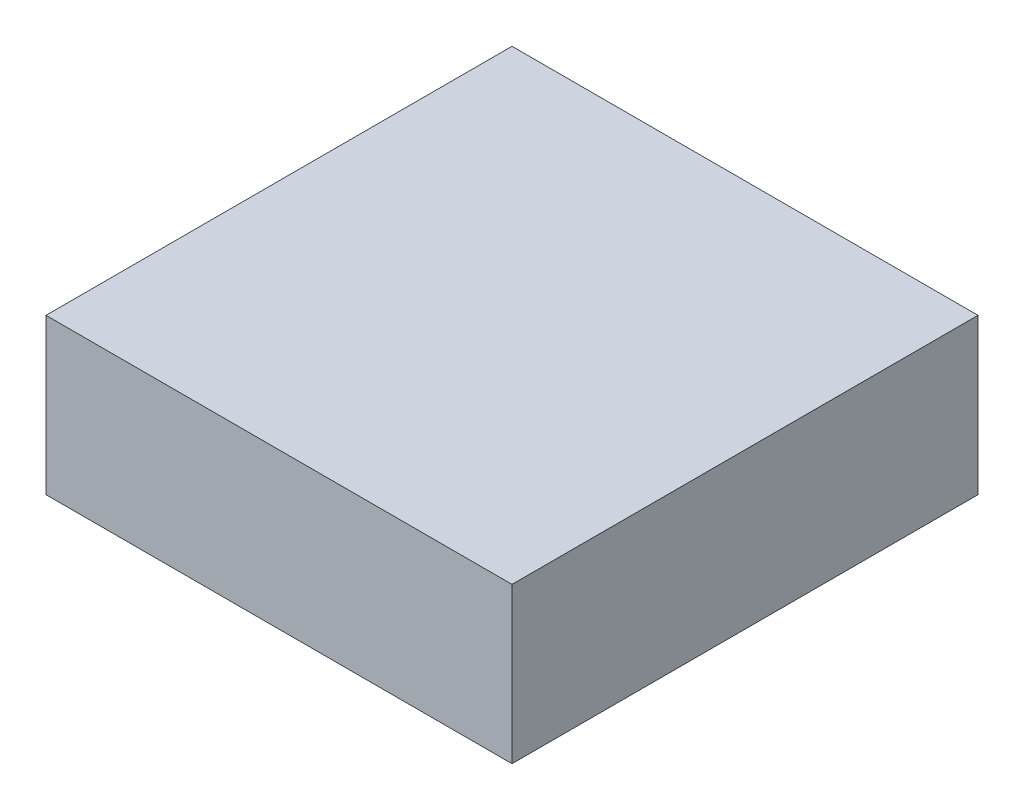
ISO-10303-21;
HEADER;
FILE_DESCRIPTION(('STEP AP214'),'2;1');
FILE_NAME('part.step','',(''),(''),'','','');
FILE_SCHEMA(('AUTOMOTIVE_DESIGN { 1 0 10303 214 1 1 1 1 }'));
ENDSEC;
DATA;
#1=APPLICATION_CONTEXT('core data for automotive mechanical design processes');
#2=APPLICATION_PROTOCOL_DEFINITION('international standard','automotive_design',2000,#1);
#3=PRODUCT_CONTEXT('',#1,'mechanical');
#4=PRODUCT('Part','Part','',(#3));
#5=PRODUCT_RELATED_PRODUCT_CATEGORY('part','',(#4));
#6=PRODUCT_DEFINITION_FORMATION('','',#4);
#7=PRODUCT_DEFINITION_CONTEXT('part definition',#1,'design');
#8=PRODUCT_DEFINITION('design','',#6,#7);
#9=PRODUCT_DEFINITION_SHAPE('','',#8);
#10=(LENGTH_UNIT() NAMED_UNIT(*) SI_UNIT(.MILLI.,.METRE.));
#11=(NAMED_UNIT(*) PLANE_ANGLE_UNIT() SI_UNIT($,.RADIAN.));
#12=(NAMED_UNIT(*) SI_UNIT($,.STERADIAN.) SOLID_ANGLE_UNIT());
#13=UNCERTAINTY_MEASURE_WITH_UNIT(LENGTH_MEASURE(1.E-05),#10,'distance_accuracy_value','');
#14=(GEOMETRIC_REPRESENTATION_CONTEXT(3) GLOBAL_UNCERTAINTY_ASSIGNED_CONTEXT((#13)) GLOBAL_UNIT_ASSIGNED_CONTEXT((#10,
#11,#12)) REPRESENTATION_CONTEXT('',''));
#15=CARTESIAN_POINT('',(0.,0.,0.));
#16=DIRECTION('',(0.,0.,1.));
#17=DIRECTION('',(1.,0.,0.));
#18=AXIS2_PLACEMENT_3D('',#15,#16,#17);
#19=CARTESIAN_POINT('',(20.,10.,13.4117647058824));
#20=DIRECTION('',(-1.,0.,0.));
#21=DIRECTION('',(0.,0.,1.));
#22=AXIS2_PLACEMENT_3D('',#19,#20,#21);
#23=PLANE('',#22);
#24=DIRECTION('',(0.,0.,-1.));
#25=VECTOR('',#24,1.);
#26=CARTESIAN_POINT('',(20.,0.,13.4117647058824));
#27=LINE('',#26,#25);
#28=CARTESIAN_POINT('',(20.,0.,13.4117647058824));
#29=VERTEX_POINT('',#28);
#30=CARTESIAN_POINT('',(20.,0.,-16.5882352941176));
#31=VERTEX_POINT('',#30);
#32=EDGE_CURVE('E98',#29,#31,#27,.T.);
#33=ORIENTED_EDGE('',*,*,#32,.T.);
#34=DIRECTION('',(0.,-1.,0.));
#35=VECTOR('',#34,1.);
#36=CARTESIAN_POINT('',(20.,10.,-16.5882352941176));
#37=LINE('',#36,#35);
#38=CARTESIAN_POINT('',(20.,10.,-16.5882352941176));
#39=VERTEX_POINT('',#38);
#40=EDGE_CURVE('E11',#39,#31,#37,.T.);
#41=ORIENTED_EDGE('',*,*,#40,.F.);
#42=DIRECTION('',(0.,0.,-1.));
#43=VECTOR('',#42,1.);
#44=CARTESIAN_POINT('',(20.,10.,13.4117647058824));
#45=LINE('',#44,#43);
#46=CARTESIAN_POINT('',(20.,10.,13.4117647058824));
#47=VERTEX_POINT('',#46);
#48=EDGE_CURVE('E86',#47,#39,#45,.T.);
#49=ORIENTED_EDGE('',*,*,#48,.F.);
#50=DIRECTION('',(0.,-1.,0.));
#51=VECTOR('',#50,1.);
#52=CARTESIAN_POINT('',(20.,10.,13.4117647058824));
#53=LINE('',#52,#51);
#54=EDGE_CURVE('E94',#47,#29,#53,.T.);
#55=ORIENTED_EDGE('',*,*,#54,.T.);
#56=EDGE_LOOP('',(#33,#41,#49,#55));
#57=FACE_BOUND('',#56,.T.);
#58=ADVANCED_FACE('F35',(#57),#23,.F.);
#59=CARTESIAN_POINT('',(-10.,10.,-16.5882352941176));
#60=DIRECTION('',(0.,0.,1.));
#61=DIRECTION('',(1.,0.,0.));
#62=AXIS2_PLACEMENT_3D('',#59,#60,#61);
#63=PLANE('',#62);
#64=DIRECTION('',(-1.,0.,0.));
#65=VECTOR('',#64,1.);
#66=CARTESIAN_POINT('',(-10.,0.,-16.5882352941176));
#67=LINE('',#66,#65);
#68=CARTESIAN_POINT('',(-10.,0.,-16.5882352941176));
#69=VERTEX_POINT('',#68);
#70=EDGE_CURVE('E90',#31,#69,#67,.T.);
#71=ORIENTED_EDGE('',*,*,#70,.T.);
#72=DIRECTION('',(0.,-1.,0.));
#73=VECTOR('',#72,1.);
#74=CARTESIAN_POINT('',(-10.,10.,-16.5882352941176));
#75=LINE('',#74,#73);
#76=CARTESIAN_POINT('',(-10.,10.,-16.5882352941176));
#77=VERTEX_POINT('',#76);
#78=EDGE_CURVE('E43',#77,#69,#75,.T.);
#79=ORIENTED_EDGE('',*,*,#78,.F.);
#80=DIRECTION('',(-1.,0.,0.));
#81=VECTOR('',#80,1.);
#82=CARTESIAN_POINT('',(-10.,10.,-16.5882352941176));
#83=LINE('',#82,#81);
#84=EDGE_CURVE('E81',#39,#77,#83,.T.);
#85=ORIENTED_EDGE('',*,*,#84,.F.);
#86=ORIENTED_EDGE('',*,*,#40,.T.);
#87=EDGE_LOOP('',(#71,#79,#85,#86));
#88=FACE_BOUND('',#87,.T.);
#89=ADVANCED_FACE('F89',(#88),#63,.F.);
#90=CARTESIAN_POINT('',(-10.,10.,13.4117647058824));
#91=DIRECTION('',(1.,0.,0.));
#92=DIRECTION('',(0.,0.,-1.));
#93=AXIS2_PLACEMENT_3D('',#90,#91,#92);
#94=PLANE('',#93);
#95=DIRECTION('',(0.,0.,1.));
#96=VECTOR('',#95,1.);
#97=CARTESIAN_POINT('',(-10.,0.,13.4117647058824));
#98=LINE('',#97,#96);
#99=CARTESIAN_POINT('',(-10.,0.,13.4117647058824));
#100=VERTEX_POINT('',#99);
#101=EDGE_CURVE('E68',#69,#100,#98,.T.);
#102=ORIENTED_EDGE('',*,*,#101,.T.);
#103=DIRECTION('',(0.,-1.,0.));
#104=VECTOR('',#103,1.);
#105=CARTESIAN_POINT('',(-10.,10.,13.4117647058824));
#106=LINE('',#105,#104);
#107=CARTESIAN_POINT('',(-10.,10.,13.4117647058824));
#108=VERTEX_POINT('',#107);
#109=EDGE_CURVE('E91',#108,#100,#106,.T.);
#110=ORIENTED_EDGE('',*,*,#109,.F.);
#111=DIRECTION('',(0.,0.,1.));
#112=VECTOR('',#111,1.);
#113=CARTESIAN_POINT('',(-10.,10.,13.4117647058824));
#114=LINE('',#113,#112);
#115=EDGE_CURVE('E84',#77,#108,#114,.T.);
#116=ORIENTED_EDGE('',*,*,#115,.F.);
#117=ORIENTED_EDGE('',*,*,#78,.T.);
#118=EDGE_LOOP('',(#102,#110,#116,#117));
#119=FACE_BOUND('',#118,.T.);
#120=ADVANCED_FACE('F92',(#119),#94,.F.);
#121=CARTESIAN_POINT('',(-10.,10.,13.4117647058824));
#122=DIRECTION('',(0.,0.,-1.));
#123=DIRECTION('',(-1.,0.,0.));
#124=AXIS2_PLACEMENT_3D('',#121,#122,#123);
#125=PLANE('',#124);
#126=DIRECTION('',(1.,0.,0.));
#127=VECTOR('',#126,1.);
#128=CARTESIAN_POINT('',(-10.,0.,13.4117647058824));
#129=LINE('',#128,#127);
#130=EDGE_CURVE('E74',#100,#29,#129,.T.);
#131=ORIENTED_EDGE('',*,*,#130,.T.);
#132=ORIENTED_EDGE('',*,*,#54,.F.);
#133=DIRECTION('',(1.,0.,0.));
#134=VECTOR('',#133,1.);
#135=CARTESIAN_POINT('',(-10.,10.,13.4117647058824));
#136=LINE('',#135,#134);
#137=EDGE_CURVE('E51',#108,#47,#136,.T.);
#138=ORIENTED_EDGE('',*,*,#137,.F.);
#139=ORIENTED_EDGE('',*,*,#109,.T.);
#140=EDGE_LOOP('',(#131,#132,#138,#139));
#141=FACE_BOUND('',#140,.T.);
#142=ADVANCED_FACE('F105',(#141),#125,.F.);
#143=CARTESIAN_POINT('',(0.,10.,0.));
#144=DIRECTION('',(0.,-1.,0.));
#145=DIRECTION('',(0.,0.,-1.));
#146=AXIS2_PLACEMENT_3D('',#143,#144,#145);
#147=PLANE('',#146);
#148=ORIENTED_EDGE('',*,*,#48,.T.);
#149=ORIENTED_EDGE('',*,*,#84,.T.);
#150=ORIENTED_EDGE('',*,*,#115,.T.);
#151=ORIENTED_EDGE('',*,*,#137,.T.);
#152=EDGE_LOOP('',(#148,#149,#150,#151));
#153=FACE_BOUND('',#152,.T.);
#154=ADVANCED_FACE('F82',(#153),#147,.F.);
#155=CARTESIAN_POINT('',(0.,0.,0.));
#156=DIRECTION('',(0.,-1.,0.));
#157=DIRECTION('',(0.,0.,-1.));
#158=AXIS2_PLACEMENT_3D('',#155,#156,#157);
#159=PLANE('',#158);
#160=ORIENTED_EDGE('',*,*,#32,.F.);
#161=ORIENTED_EDGE('',*,*,#130,.F.);
#162=ORIENTED_EDGE('',*,*,#101,.F.);
#163=ORIENTED_EDGE('',*,*,#70,.F.);
#164=EDGE_LOOP('',(#160,#161,#162,#163));
#165=FACE_BOUND('',#164,.T.);
#166=ADVANCED_FACE('F108',(#165),#159,.T.);
#167=CLOSED_SHELL('',(#58,#89,#120,#142,#154,#166));
#168=MANIFOLD_SOLID_BREP('B2',#167);
#169=ADVANCED_BREP_SHAPE_REPRESENTATION('',(#18,#168),#14);
#170=SHAPE_DEFINITION_REPRESENTATION(#9,#169);
ENDSEC;
END-ISO-10303-21;
